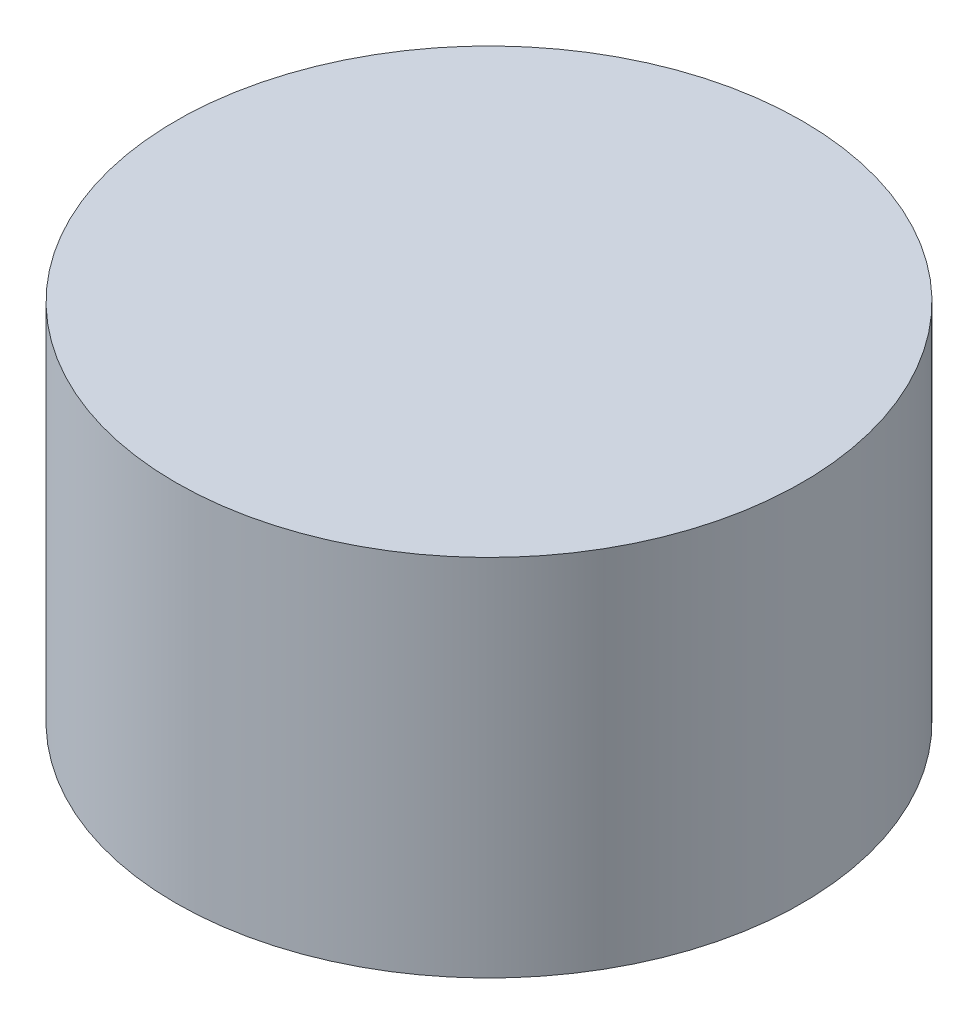
ISO-10303-21;
HEADER;
FILE_DESCRIPTION(('STEP AP214'),'2;1');
FILE_NAME('part.step','',(''),(''),'','','');
FILE_SCHEMA(('AUTOMOTIVE_DESIGN { 1 0 10303 214 1 1 1 1 }'));
ENDSEC;
DATA;
#1=APPLICATION_CONTEXT('core data for automotive mechanical design processes');
#2=APPLICATION_PROTOCOL_DEFINITION('international standard','automotive_design',2000,#1);
#3=PRODUCT_CONTEXT('',#1,'mechanical');
#4=PRODUCT('Part','Part','',(#3));
#5=PRODUCT_RELATED_PRODUCT_CATEGORY('part','',(#4));
#6=PRODUCT_DEFINITION_FORMATION('','',#4);
#7=PRODUCT_DEFINITION_CONTEXT('part definition',#1,'design');
#8=PRODUCT_DEFINITION('design','',#6,#7);
#9=PRODUCT_DEFINITION_SHAPE('','',#8);
#10=(LENGTH_UNIT() NAMED_UNIT(*) SI_UNIT(.MILLI.,.METRE.));
#11=(NAMED_UNIT(*) PLANE_ANGLE_UNIT() SI_UNIT($,.RADIAN.));
#12=(NAMED_UNIT(*) SI_UNIT($,.STERADIAN.) SOLID_ANGLE_UNIT());
#13=UNCERTAINTY_MEASURE_WITH_UNIT(LENGTH_MEASURE(1.E-05),#10,'distance_accuracy_value','');
#14=(GEOMETRIC_REPRESENTATION_CONTEXT(3) GLOBAL_UNCERTAINTY_ASSIGNED_CONTEXT((#13)) GLOBAL_UNIT_ASSIGNED_CONTEXT((#10,
#11,#12)) REPRESENTATION_CONTEXT('',''));
#15=CARTESIAN_POINT('',(0.,0.,0.));
#16=DIRECTION('',(0.,0.,1.));
#17=DIRECTION('',(1.,0.,0.));
#18=AXIS2_PLACEMENT_3D('',#15,#16,#17);
#19=CARTESIAN_POINT('',(0.,5.,0.));
#20=DIRECTION('',(0.,-1.,0.));
#21=DIRECTION('',(0.,0.,-1.));
#22=AXIS2_PLACEMENT_3D('',#19,#20,#21);
#23=CYLINDRICAL_SURFACE('',#22,4.3);
#24=CARTESIAN_POINT('',(0.,5.,0.));
#25=DIRECTION('',(0.,1.,0.));
#26=DIRECTION('',(0.,0.,1.));
#27=AXIS2_PLACEMENT_3D('',#24,#25,#26);
#28=CIRCLE('',#27,4.3);
#29=CARTESIAN_POINT('',(0.,5.,4.3));
#30=VERTEX_POINT('',#29);
#31=EDGE_CURVE('E10',#30,#30,#28,.T.);
#32=ORIENTED_EDGE('',*,*,#31,.F.);
#33=EDGE_LOOP('',(#32));
#34=FACE_BOUND('',#33,.T.);
#35=CARTESIAN_POINT('',(0.,0.,0.));
#36=DIRECTION('',(0.,1.,0.));
#37=DIRECTION('',(0.,0.,1.));
#38=AXIS2_PLACEMENT_3D('',#35,#36,#37);
#39=CIRCLE('',#38,4.3);
#40=CARTESIAN_POINT('',(0.,0.,4.3));
#41=VERTEX_POINT('',#40);
#42=EDGE_CURVE('E34',#41,#41,#39,.T.);
#43=ORIENTED_EDGE('',*,*,#42,.T.);
#44=EDGE_LOOP('',(#43));
#45=FACE_BOUND('',#44,.T.);
#46=ADVANCED_FACE('F31',(#34,#45),#23,.T.);
#47=CARTESIAN_POINT('',(0.,5.,0.));
#48=DIRECTION('',(0.,1.,0.));
#49=DIRECTION('',(0.,0.,1.));
#50=AXIS2_PLACEMENT_3D('',#47,#48,#49);
#51=PLANE('',#50);
#52=ORIENTED_EDGE('',*,*,#31,.T.);
#53=EDGE_LOOP('',(#52));
#54=FACE_BOUND('',#53,.T.);
#55=ADVANCED_FACE('F46',(#54),#51,.T.);
#56=CARTESIAN_POINT('',(0.,0.,0.));
#57=DIRECTION('',(0.,1.,0.));
#58=DIRECTION('',(0.,0.,1.));
#59=AXIS2_PLACEMENT_3D('',#56,#57,#58);
#60=PLANE('',#59);
#61=ORIENTED_EDGE('',*,*,#42,.F.);
#62=EDGE_LOOP('',(#61));
#63=FACE_BOUND('',#62,.T.);
#64=ADVANCED_FACE('F44',(#63),#60,.F.);
#65=CLOSED_SHELL('',(#46,#55,#64));
#66=MANIFOLD_SOLID_BREP('B2',#65);
#67=ADVANCED_BREP_SHAPE_REPRESENTATION('',(#18,#66),#14);
#68=SHAPE_DEFINITION_REPRESENTATION(#9,#67);
ENDSEC;
END-ISO-10303-21;
